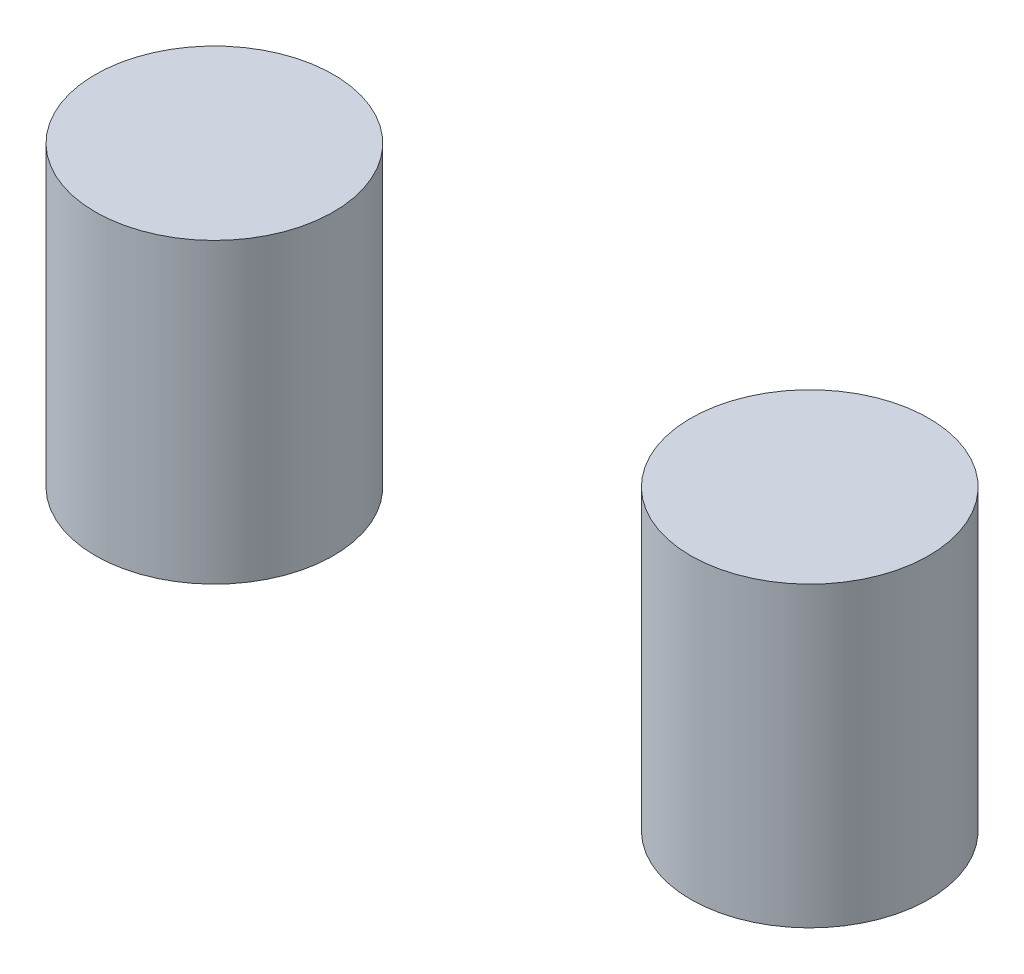
ISO-10303-21;
HEADER;
FILE_DESCRIPTION(('STEP AP214'),'2;1');
FILE_NAME('part.step','',(''),(''),'','','');
FILE_SCHEMA(('AUTOMOTIVE_DESIGN { 1 0 10303 214 1 1 1 1 }'));
ENDSEC;
DATA;
#1=APPLICATION_CONTEXT('core data for automotive mechanical design processes');
#2=APPLICATION_PROTOCOL_DEFINITION('international standard','automotive_design',2000,#1);
#3=PRODUCT_CONTEXT('',#1,'mechanical');
#4=PRODUCT('Part','Part','',(#3));
#5=PRODUCT_RELATED_PRODUCT_CATEGORY('part','',(#4));
#6=PRODUCT_DEFINITION_FORMATION('','',#4);
#7=PRODUCT_DEFINITION_CONTEXT('part definition',#1,'design');
#8=PRODUCT_DEFINITION('design','',#6,#7);
#9=PRODUCT_DEFINITION_SHAPE('','',#8);
#10=(LENGTH_UNIT() NAMED_UNIT(*) SI_UNIT(.MILLI.,.METRE.));
#11=(NAMED_UNIT(*) PLANE_ANGLE_UNIT() SI_UNIT($,.RADIAN.));
#12=(NAMED_UNIT(*) SI_UNIT($,.STERADIAN.) SOLID_ANGLE_UNIT());
#13=UNCERTAINTY_MEASURE_WITH_UNIT(LENGTH_MEASURE(1.E-05),#10,'distance_accuracy_value','');
#14=(GEOMETRIC_REPRESENTATION_CONTEXT(3) GLOBAL_UNCERTAINTY_ASSIGNED_CONTEXT((#13)) GLOBAL_UNIT_ASSIGNED_CONTEXT((#10,
#11,#12)) REPRESENTATION_CONTEXT('',''));
#15=CARTESIAN_POINT('',(0.,0.,0.));
#16=DIRECTION('',(0.,0.,1.));
#17=DIRECTION('',(1.,0.,0.));
#18=AXIS2_PLACEMENT_3D('',#15,#16,#17);
#19=CARTESIAN_POINT('',(-10.,10.,0.));
#20=DIRECTION('',(0.,-1.,0.));
#21=DIRECTION('',(0.,0.,-1.));
#22=AXIS2_PLACEMENT_3D('',#19,#20,#21);
#23=CYLINDRICAL_SURFACE('',#22,4.);
#24=CARTESIAN_POINT('',(-10.,10.,0.));
#25=DIRECTION('',(0.,1.,0.));
#26=DIRECTION('',(0.,0.,1.));
#27=AXIS2_PLACEMENT_3D('',#24,#25,#26);
#28=CIRCLE('',#27,4.);
#29=CARTESIAN_POINT('',(-10.,10.,4.));
#30=VERTEX_POINT('',#29);
#31=EDGE_CURVE('E11',#30,#30,#28,.T.);
#32=ORIENTED_EDGE('',*,*,#31,.F.);
#33=EDGE_LOOP('',(#32));
#34=FACE_BOUND('',#33,.T.);
#35=CARTESIAN_POINT('',(-10.,0.,0.));
#36=DIRECTION('',(0.,1.,0.));
#37=DIRECTION('',(0.,0.,1.));
#38=AXIS2_PLACEMENT_3D('',#35,#36,#37);
#39=CIRCLE('',#38,4.);
#40=CARTESIAN_POINT('',(-10.,0.,4.));
#41=VERTEX_POINT('',#40);
#42=EDGE_CURVE('E42',#41,#41,#39,.T.);
#43=ORIENTED_EDGE('',*,*,#42,.T.);
#44=EDGE_LOOP('',(#43));
#45=FACE_BOUND('',#44,.T.);
#46=ADVANCED_FACE('F39',(#34,#45),#23,.T.);
#47=CARTESIAN_POINT('',(-10.,10.,0.));
#48=DIRECTION('',(0.,1.,0.));
#49=DIRECTION('',(0.,0.,1.));
#50=AXIS2_PLACEMENT_3D('',#47,#48,#49);
#51=PLANE('',#50);
#52=ORIENTED_EDGE('',*,*,#31,.T.);
#53=EDGE_LOOP('',(#52));
#54=FACE_BOUND('',#53,.T.);
#55=ADVANCED_FACE('F54',(#54),#51,.T.);
#56=CARTESIAN_POINT('',(-10.,0.,0.));
#57=DIRECTION('',(0.,1.,0.));
#58=DIRECTION('',(0.,0.,1.));
#59=AXIS2_PLACEMENT_3D('',#56,#57,#58);
#60=PLANE('',#59);
#61=ORIENTED_EDGE('',*,*,#42,.F.);
#62=EDGE_LOOP('',(#61));
#63=FACE_BOUND('',#62,.T.);
#64=ADVANCED_FACE('F52',(#63),#60,.F.);
#65=CLOSED_SHELL('',(#46,#55,#64));
#66=MANIFOLD_SOLID_BREP('B2',#65);
#67=CARTESIAN_POINT('',(10.,10.,0.));
#68=DIRECTION('',(0.,-1.,0.));
#69=DIRECTION('',(0.,0.,-1.));
#70=AXIS2_PLACEMENT_3D('',#67,#68,#69);
#71=CYLINDRICAL_SURFACE('',#70,4.);
#72=CARTESIAN_POINT('',(10.,10.,0.));
#73=DIRECTION('',(0.,1.,0.));
#74=DIRECTION('',(0.,0.,1.));
#75=AXIS2_PLACEMENT_3D('',#72,#73,#74);
#76=CIRCLE('',#75,4.);
#77=CARTESIAN_POINT('',(10.,10.,4.));
#78=VERTEX_POINT('',#77);
#79=EDGE_CURVE('E38',#78,#78,#76,.T.);
#80=ORIENTED_EDGE('',*,*,#79,.F.);
#81=EDGE_LOOP('',(#80));
#82=FACE_BOUND('',#81,.T.);
#83=CARTESIAN_POINT('',(10.,0.,0.));
#84=DIRECTION('',(0.,1.,0.));
#85=DIRECTION('',(0.,0.,1.));
#86=AXIS2_PLACEMENT_3D('',#83,#84,#85);
#87=CIRCLE('',#86,4.);
#88=CARTESIAN_POINT('',(10.,0.,4.));
#89=VERTEX_POINT('',#88);
#90=EDGE_CURVE('E83',#89,#89,#87,.T.);
#91=ORIENTED_EDGE('',*,*,#90,.T.);
#92=EDGE_LOOP('',(#91));
#93=FACE_BOUND('',#92,.T.);
#94=ADVANCED_FACE('F80',(#82,#93),#71,.T.);
#95=CARTESIAN_POINT('',(10.,10.,0.));
#96=DIRECTION('',(0.,1.,0.));
#97=DIRECTION('',(0.,0.,1.));
#98=AXIS2_PLACEMENT_3D('',#95,#96,#97);
#99=PLANE('',#98);
#100=ORIENTED_EDGE('',*,*,#79,.T.);
#101=EDGE_LOOP('',(#100));
#102=FACE_BOUND('',#101,.T.);
#103=ADVANCED_FACE('F95',(#102),#99,.T.);
#104=CARTESIAN_POINT('',(10.,0.,0.));
#105=DIRECTION('',(0.,1.,0.));
#106=DIRECTION('',(0.,0.,1.));
#107=AXIS2_PLACEMENT_3D('',#104,#105,#106);
#108=PLANE('',#107);
#109=ORIENTED_EDGE('',*,*,#90,.F.);
#110=EDGE_LOOP('',(#109));
#111=FACE_BOUND('',#110,.T.);
#112=ADVANCED_FACE('F93',(#111),#108,.F.);
#113=CLOSED_SHELL('',(#94,#103,#112));
#114=MANIFOLD_SOLID_BREP('B6',#113);
#115=ADVANCED_BREP_SHAPE_REPRESENTATION('',(#18,#66,#114),#14);
#116=SHAPE_DEFINITION_REPRESENTATION(#9,#115);
ENDSEC;
END-ISO-10303-21;
